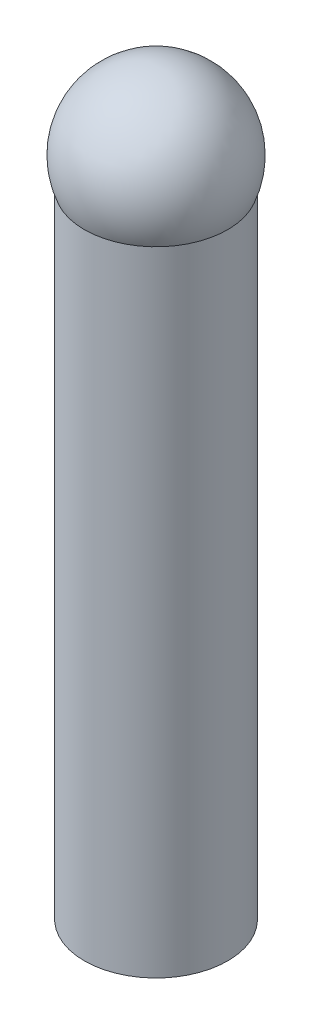
ISO-10303-21;
HEADER;
FILE_DESCRIPTION(('STEP AP214'),'2;1');
FILE_NAME('part.step','',(''),(''),'','','');
FILE_SCHEMA(('AUTOMOTIVE_DESIGN { 1 0 10303 214 1 1 1 1 }'));
ENDSEC;
DATA;
#1=APPLICATION_CONTEXT('core data for automotive mechanical design processes');
#2=APPLICATION_PROTOCOL_DEFINITION('international standard','automotive_design',2000,#1);
#3=PRODUCT_CONTEXT('',#1,'mechanical');
#4=PRODUCT('Part','Part','',(#3));
#5=PRODUCT_RELATED_PRODUCT_CATEGORY('part','',(#4));
#6=PRODUCT_DEFINITION_FORMATION('','',#4);
#7=PRODUCT_DEFINITION_CONTEXT('part definition',#1,'design');
#8=PRODUCT_DEFINITION('design','',#6,#7);
#9=PRODUCT_DEFINITION_SHAPE('','',#8);
#10=(LENGTH_UNIT() NAMED_UNIT(*) SI_UNIT(.MILLI.,.METRE.));
#11=(NAMED_UNIT(*) PLANE_ANGLE_UNIT() SI_UNIT($,.RADIAN.));
#12=(NAMED_UNIT(*) SI_UNIT($,.STERADIAN.) SOLID_ANGLE_UNIT());
#13=UNCERTAINTY_MEASURE_WITH_UNIT(LENGTH_MEASURE(1.E-05),#10,'distance_accuracy_value','');
#14=(GEOMETRIC_REPRESENTATION_CONTEXT(3) GLOBAL_UNCERTAINTY_ASSIGNED_CONTEXT((#13)) GLOBAL_UNIT_ASSIGNED_CONTEXT((#10,
#11,#12)) REPRESENTATION_CONTEXT('',''));
#15=CARTESIAN_POINT('',(0.,0.,0.));
#16=DIRECTION('',(0.,0.,1.));
#17=DIRECTION('',(1.,0.,0.));
#18=AXIS2_PLACEMENT_3D('',#15,#16,#17);
#19=CARTESIAN_POINT('',(0.,6.,0.));
#20=DIRECTION('',(1.,0.,0.));
#21=DIRECTION('',(0.,-1.,0.));
#22=AXIS2_PLACEMENT_3D('',#19,#20,#21);
#23=SPHERICAL_SURFACE('',#22,0.7);
#24=CARTESIAN_POINT('',(0.,6.,0.));
#25=DIRECTION('',(0.,1.,0.));
#26=DIRECTION('',(0.,0.,1.));
#27=AXIS2_PLACEMENT_3D('',#24,#25,#26);
#28=SPHERICAL_SURFACE('',#27,0.7);
#29=CARTESIAN_POINT('',(0.,5.74019237886467,0.));
#30=DIRECTION('',(0.,1.,0.));
#31=DIRECTION('',(0.,0.,1.));
#32=AXIS2_PLACEMENT_3D('',#29,#30,#31);
#33=CIRCLE('',#32,0.65);
#34=CARTESIAN_POINT('',(0.,5.74019237886467,0.65));
#35=VERTEX_POINT('',#34);
#36=EDGE_CURVE('E39',#35,#35,#33,.F.);
#37=ORIENTED_EDGE('',*,*,#36,.F.);
#38=EDGE_LOOP('',(#37));
#39=FACE_BOUND('',#38,.T.);
#40=ADVANCED_FACE('F35',(#39),#28,.T.);
#41=CARTESIAN_POINT('',(0.,6.,0.));
#42=DIRECTION('',(0.,-1.,0.));
#43=DIRECTION('',(0.,0.,-1.));
#44=AXIS2_PLACEMENT_3D('',#41,#42,#43);
#45=CYLINDRICAL_SURFACE('',#44,0.65);
#46=ORIENTED_EDGE('',*,*,#36,.T.);
#47=EDGE_LOOP('',(#46));
#48=FACE_BOUND('',#47,.T.);
#49=CARTESIAN_POINT('',(0.,0.,0.));
#50=DIRECTION('',(0.,1.,0.));
#51=DIRECTION('',(0.,0.,1.));
#52=AXIS2_PLACEMENT_3D('',#49,#50,#51);
#53=CIRCLE('',#52,0.65);
#54=CARTESIAN_POINT('',(0.,0.,0.65));
#55=VERTEX_POINT('',#54);
#56=EDGE_CURVE('E10',#55,#55,#53,.T.);
#57=ORIENTED_EDGE('',*,*,#56,.T.);
#58=EDGE_LOOP('',(#57));
#59=FACE_BOUND('',#58,.T.);
#60=ADVANCED_FACE('F37',(#48,#59),#45,.T.);
#61=CARTESIAN_POINT('',(0.,0.,0.));
#62=DIRECTION('',(0.,1.,0.));
#63=DIRECTION('',(0.,0.,1.));
#64=AXIS2_PLACEMENT_3D('',#61,#62,#63);
#65=PLANE('',#64);
#66=ORIENTED_EDGE('',*,*,#56,.F.);
#67=EDGE_LOOP('',(#66));
#68=FACE_BOUND('',#67,.T.);
#69=ADVANCED_FACE('F54',(#68),#65,.F.);
#70=CLOSED_SHELL('',(#40,#60,#69));
#71=MANIFOLD_SOLID_BREP('B2',#70);
#72=ADVANCED_BREP_SHAPE_REPRESENTATION('',(#18,#71),#14);
#73=SHAPE_DEFINITION_REPRESENTATION(#9,#72);
ENDSEC;
END-ISO-10303-21;
